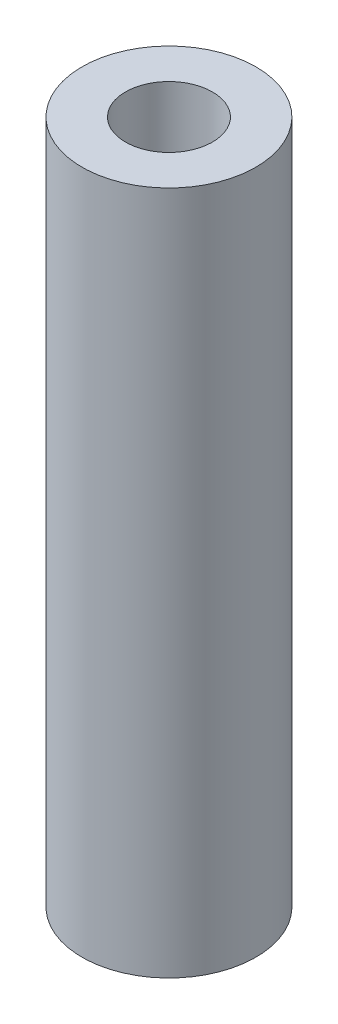
ISO-10303-21;
HEADER;
FILE_DESCRIPTION(('STEP AP214'),'2;1');
FILE_NAME('part.step','',(''),(''),'','','');
FILE_SCHEMA(('AUTOMOTIVE_DESIGN { 1 0 10303 214 1 1 1 1 }'));
ENDSEC;
DATA;
#1=APPLICATION_CONTEXT('core data for automotive mechanical design processes');
#2=APPLICATION_PROTOCOL_DEFINITION('international standard','automotive_design',2000,#1);
#3=PRODUCT_CONTEXT('',#1,'mechanical');
#4=PRODUCT('Part','Part','',(#3));
#5=PRODUCT_RELATED_PRODUCT_CATEGORY('part','',(#4));
#6=PRODUCT_DEFINITION_FORMATION('','',#4);
#7=PRODUCT_DEFINITION_CONTEXT('part definition',#1,'design');
#8=PRODUCT_DEFINITION('design','',#6,#7);
#9=PRODUCT_DEFINITION_SHAPE('','',#8);
#10=(LENGTH_UNIT() NAMED_UNIT(*) SI_UNIT(.MILLI.,.METRE.));
#11=(NAMED_UNIT(*) PLANE_ANGLE_UNIT() SI_UNIT($,.RADIAN.));
#12=(NAMED_UNIT(*) SI_UNIT($,.STERADIAN.) SOLID_ANGLE_UNIT());
#13=UNCERTAINTY_MEASURE_WITH_UNIT(LENGTH_MEASURE(1.E-05),#10,'distance_accuracy_value','');
#14=(GEOMETRIC_REPRESENTATION_CONTEXT(3) GLOBAL_UNCERTAINTY_ASSIGNED_CONTEXT((#13)) GLOBAL_UNIT_ASSIGNED_CONTEXT((#10,
#11,#12)) REPRESENTATION_CONTEXT('',''));
#15=CARTESIAN_POINT('',(0.,0.,0.));
#16=DIRECTION('',(0.,0.,1.));
#17=DIRECTION('',(1.,0.,0.));
#18=AXIS2_PLACEMENT_3D('',#15,#16,#17);
#19=CARTESIAN_POINT('',(-32.5248384950962,49.9618,-24.5388290431753));
#20=DIRECTION('',(0.,1.,0.));
#21=DIRECTION('',(0.,0.,1.));
#22=AXIS2_PLACEMENT_3D('',#19,#20,#21);
#23=PLANE('',#22);
#24=CARTESIAN_POINT('',(-32.5248384950962,49.9618,-24.5388290431753));
#25=DIRECTION('',(0.,1.,0.));
#26=DIRECTION('',(0.,0.,1.));
#27=AXIS2_PLACEMENT_3D('',#24,#25,#26);
#28=CIRCLE('',#27,6.35);
#29=CARTESIAN_POINT('',(-32.5248384950962,49.9618,-30.8888290431753));
#30=VERTEX_POINT('',#29);
#31=EDGE_CURVE('E10',#30,#30,#28,.T.);
#32=ORIENTED_EDGE('',*,*,#31,.T.);
#33=EDGE_LOOP('',(#32));
#34=FACE_BOUND('',#33,.T.);
#35=CARTESIAN_POINT('',(-32.5248384950962,49.9618,-24.5388290431753));
#36=DIRECTION('',(0.,1.,0.));
#37=DIRECTION('',(0.,0.,1.));
#38=AXIS2_PLACEMENT_3D('',#35,#36,#37);
#39=CIRCLE('',#38,3.175);
#40=CARTESIAN_POINT('',(-32.5248384950962,49.9618,-27.7138290431753));
#41=VERTEX_POINT('',#40);
#42=EDGE_CURVE('E41',#41,#41,#39,.T.);
#43=ORIENTED_EDGE('',*,*,#42,.F.);
#44=EDGE_LOOP('',(#43));
#45=FACE_BOUND('',#44,.T.);
#46=ADVANCED_FACE('F30',(#34,#45),#23,.T.);
#47=CARTESIAN_POINT('',(-32.5248384950962,0.,-24.5388290431753));
#48=DIRECTION('',(0.,1.,0.));
#49=DIRECTION('',(0.,0.,1.));
#50=AXIS2_PLACEMENT_3D('',#47,#48,#49);
#51=PLANE('',#50);
#52=CARTESIAN_POINT('',(-32.5248384950962,0.,-24.5388290431753));
#53=DIRECTION('',(0.,1.,0.));
#54=DIRECTION('',(0.,0.,1.));
#55=AXIS2_PLACEMENT_3D('',#52,#53,#54);
#56=CIRCLE('',#55,6.35);
#57=CARTESIAN_POINT('',(-32.5248384950962,0.,-30.8888290431753));
#58=VERTEX_POINT('',#57);
#59=EDGE_CURVE('E34',#58,#58,#56,.T.);
#60=ORIENTED_EDGE('',*,*,#59,.F.);
#61=EDGE_LOOP('',(#60));
#62=FACE_BOUND('',#61,.T.);
#63=CARTESIAN_POINT('',(-32.5248384950962,0.,-24.5388290431753));
#64=DIRECTION('',(0.,1.,0.));
#65=DIRECTION('',(0.,0.,1.));
#66=AXIS2_PLACEMENT_3D('',#63,#64,#65);
#67=CIRCLE('',#66,3.175);
#68=CARTESIAN_POINT('',(-32.5248384950962,0.,-27.7138290431753));
#69=VERTEX_POINT('',#68);
#70=EDGE_CURVE('E43',#69,#69,#67,.T.);
#71=ORIENTED_EDGE('',*,*,#70,.T.);
#72=EDGE_LOOP('',(#71));
#73=FACE_BOUND('',#72,.T.);
#74=ADVANCED_FACE('F53',(#62,#73),#51,.F.);
#75=CARTESIAN_POINT('',(-32.5248384950962,49.9618,-24.5388290431753));
#76=DIRECTION('',(0.,-1.,0.));
#77=DIRECTION('',(0.,0.,-1.));
#78=AXIS2_PLACEMENT_3D('',#75,#76,#77);
#79=CYLINDRICAL_SURFACE('',#78,6.35);
#80=CARTESIAN_POINT('',(-32.5248384950962,49.9618,-30.8888290431753));
#81=CARTESIAN_POINT('',(-32.5248384950962,49.4413645833333,-30.8888290431753));
#82=CARTESIAN_POINT('',(-32.5248384950962,48.9209291666667,-30.8888290431753));
#83=CARTESIAN_POINT('',(-32.5248384950962,47.8800583333333,-30.8888290431753));
#84=CARTESIAN_POINT('',(-32.5248384950962,47.3596229166667,-30.8888290431753));
#85=CARTESIAN_POINT('',(-32.5248384950962,46.3187520833333,-30.8888290431753));
#86=CARTESIAN_POINT('',(-32.5248384950962,45.7983166666667,-30.8888290431753));
#87=CARTESIAN_POINT('',(-32.5248384950962,44.7574458333333,-30.8888290431753));
#88=CARTESIAN_POINT('',(-32.5248384950962,44.2370104166667,-30.8888290431753));
#89=CARTESIAN_POINT('',(-32.5248384950962,43.1961395833333,-30.8888290431753));
#90=CARTESIAN_POINT('',(-32.5248384950962,42.6757041666667,-30.8888290431753));
#91=CARTESIAN_POINT('',(-32.5248384950962,41.6348333333333,-30.8888290431753));
#92=CARTESIAN_POINT('',(-32.5248384950962,41.1143979166667,-30.8888290431753));
#93=CARTESIAN_POINT('',(-32.5248384950962,40.0735270833333,-30.8888290431753));
#94=CARTESIAN_POINT('',(-32.5248384950962,39.5530916666667,-30.8888290431753));
#95=CARTESIAN_POINT('',(-32.5248384950962,38.5122208333333,-30.8888290431753));
#96=CARTESIAN_POINT('',(-32.5248384950962,37.9917854166667,-30.8888290431753));
#97=CARTESIAN_POINT('',(-32.5248384950962,36.9509145833333,-30.8888290431753));
#98=CARTESIAN_POINT('',(-32.5248384950962,36.4304791666667,-30.8888290431753));
#99=CARTESIAN_POINT('',(-32.5248384950962,35.3896083333333,-30.8888290431753));
#100=CARTESIAN_POINT('',(-32.5248384950962,34.8691729166667,-30.8888290431753));
#101=CARTESIAN_POINT('',(-32.5248384950962,33.8283020833333,-30.8888290431753));
#102=CARTESIAN_POINT('',(-32.5248384950962,33.3078666666667,-30.8888290431753));
#103=CARTESIAN_POINT('',(-32.5248384950962,32.2669958333333,-30.8888290431753));
#104=CARTESIAN_POINT('',(-32.5248384950962,31.7465604166667,-30.8888290431753));
#105=CARTESIAN_POINT('',(-32.5248384950962,30.7056895833333,-30.8888290431753));
#106=CARTESIAN_POINT('',(-32.5248384950962,30.1852541666667,-30.8888290431753));
#107=CARTESIAN_POINT('',(-32.5248384950962,29.1443833333333,-30.8888290431753));
#108=CARTESIAN_POINT('',(-32.5248384950962,28.6239479166667,-30.8888290431753));
#109=CARTESIAN_POINT('',(-32.5248384950962,27.5830770833333,-30.8888290431753));
#110=CARTESIAN_POINT('',(-32.5248384950962,27.0626416666667,-30.8888290431753));
#111=CARTESIAN_POINT('',(-32.5248384950962,26.0217708333333,-30.8888290431753));
#112=CARTESIAN_POINT('',(-32.5248384950962,25.5013354166667,-30.8888290431753));
#113=CARTESIAN_POINT('',(-32.5248384950962,24.4604645833333,-30.8888290431753));
#114=CARTESIAN_POINT('',(-32.5248384950962,23.9400291666667,-30.8888290431753));
#115=CARTESIAN_POINT('',(-32.5248384950962,22.8991583333333,-30.8888290431753));
#116=CARTESIAN_POINT('',(-32.5248384950962,22.3787229166667,-30.8888290431753));
#117=CARTESIAN_POINT('',(-32.5248384950962,21.3378520833333,-30.8888290431753));
#118=CARTESIAN_POINT('',(-32.5248384950962,20.8174166666667,-30.8888290431753));
#119=CARTESIAN_POINT('',(-32.5248384950962,19.7765458333333,-30.8888290431753));
#120=CARTESIAN_POINT('',(-32.5248384950962,19.2561104166667,-30.8888290431753));
#121=CARTESIAN_POINT('',(-32.5248384950962,18.2152395833333,-30.8888290431753));
#122=CARTESIAN_POINT('',(-32.5248384950962,17.6948041666667,-30.8888290431753));
#123=CARTESIAN_POINT('',(-32.5248384950962,16.6539333333333,-30.8888290431753));
#124=CARTESIAN_POINT('',(-32.5248384950962,16.1334979166667,-30.8888290431753));
#125=CARTESIAN_POINT('',(-32.5248384950962,15.0926270833333,-30.8888290431753));
#126=CARTESIAN_POINT('',(-32.5248384950962,14.5721916666667,-30.8888290431753));
#127=CARTESIAN_POINT('',(-32.5248384950962,13.5313208333333,-30.8888290431753));
#128=CARTESIAN_POINT('',(-32.5248384950962,13.0108854166667,-30.8888290431753));
#129=CARTESIAN_POINT('',(-32.5248384950962,11.9700145833333,-30.8888290431753));
#130=CARTESIAN_POINT('',(-32.5248384950962,11.4495791666667,-30.8888290431753));
#131=CARTESIAN_POINT('',(-32.5248384950962,10.4087083333333,-30.8888290431753));
#132=CARTESIAN_POINT('',(-32.5248384950962,9.88827291666666,-30.8888290431753));
#133=CARTESIAN_POINT('',(-32.5248384950962,8.84740208333333,-30.8888290431753));
#134=CARTESIAN_POINT('',(-32.5248384950962,8.32696666666666,-30.8888290431753));
#135=CARTESIAN_POINT('',(-32.5248384950962,7.28609583333333,-30.8888290431753));
#136=CARTESIAN_POINT('',(-32.5248384950962,6.76566041666666,-30.8888290431753));
#137=CARTESIAN_POINT('',(-32.5248384950962,5.72478958333333,-30.8888290431753));
#138=CARTESIAN_POINT('',(-32.5248384950962,5.20435416666666,-30.8888290431753));
#139=CARTESIAN_POINT('',(-32.5248384950962,4.16348333333333,-30.8888290431753));
#140=CARTESIAN_POINT('',(-32.5248384950962,3.64304791666666,-30.8888290431753));
#141=CARTESIAN_POINT('',(-32.5248384950962,2.60217708333333,-30.8888290431753));
#142=CARTESIAN_POINT('',(-32.5248384950962,2.08174166666666,-30.8888290431753));
#143=CARTESIAN_POINT('',(-32.5248384950962,1.04087083333333,-30.8888290431753));
#144=CARTESIAN_POINT('',(-32.5248384950962,0.520435416666659,-30.8888290431753));
#145=CARTESIAN_POINT('',(-32.5248384950962,0.,-30.8888290431753));
#146=B_SPLINE_CURVE_WITH_KNOTS('',3,(#80,#81,#82,#83,#84,#85,#86,#87,#88,#89,#90,#91,#92,#93,
#94,#95,#96,#97,#98,#99,#100,#101,#102,#103,#104,#105,#106,#107,#108,#109,#110,#111,#112,#113,
#114,#115,#116,#117,#118,#119,#120,#121,#122,#123,#124,#125,#126,#127,#128,#129,#130,#131,#132,
#133,#134,#135,#136,#137,#138,#139,#140,#141,#142,#143,#144,#145),.UNSPECIFIED.,.F.,.F.,(4,2,2,
2,2,2,2,2,2,2,2,2,2,2,2,2,2,2,2,2,2,2,2,2,2,2,2,2,2,2,2,2,4),(0.,1.56130625,3.1226125,
4.68391874999999,6.245225,7.80653125,9.3678375,10.92914375,12.49045,14.05175625,15.6130625,
17.17436875,18.735675,20.29698125,21.8582875,23.41959375,24.9809,26.54220625,28.1035125,
29.66481875,31.226125,32.78743125,34.3487375,35.91004375,37.47135,39.03265625,40.5939625,
42.15526875,43.716575,45.27788125,46.8391875,48.40049375,49.9618),.UNSPECIFIED.);
#147=EDGE_CURVE('BSEAM32',#30,#58,#146,.T.);
#148=ORIENTED_EDGE('',*,*,#31,.F.);
#149=ORIENTED_EDGE('',*,*,#59,.T.);
#150=ORIENTED_EDGE('',*,*,#147,.T.);
#151=ORIENTED_EDGE('',*,*,#147,.F.);
#152=EDGE_LOOP('',(#148,#150,#149,#151));
#153=FACE_BOUND('',#152,.T.);
#154=ADVANCED_FACE('F32',(#153),#79,.T.);
#155=CARTESIAN_POINT('',(-32.5248384950962,49.9618,-24.5388290431753));
#156=DIRECTION('',(0.,-1.,0.));
#157=DIRECTION('',(0.,0.,-1.));
#158=AXIS2_PLACEMENT_3D('',#155,#156,#157);
#159=CYLINDRICAL_SURFACE('',#158,3.175);
#160=CARTESIAN_POINT('',(-32.5248384950962,49.9618,-27.7138290431753));
#161=CARTESIAN_POINT('',(-32.5248384950962,49.4413645833333,-27.7138290431753));
#162=CARTESIAN_POINT('',(-32.5248384950962,48.9209291666667,-27.7138290431753));
#163=CARTESIAN_POINT('',(-32.5248384950962,47.8800583333333,-27.7138290431753));
#164=CARTESIAN_POINT('',(-32.5248384950962,47.3596229166667,-27.7138290431753));
#165=CARTESIAN_POINT('',(-32.5248384950962,46.3187520833333,-27.7138290431753));
#166=CARTESIAN_POINT('',(-32.5248384950962,45.7983166666667,-27.7138290431753));
#167=CARTESIAN_POINT('',(-32.5248384950962,44.7574458333333,-27.7138290431753));
#168=CARTESIAN_POINT('',(-32.5248384950962,44.2370104166667,-27.7138290431753));
#169=CARTESIAN_POINT('',(-32.5248384950962,43.1961395833333,-27.7138290431753));
#170=CARTESIAN_POINT('',(-32.5248384950962,42.6757041666667,-27.7138290431753));
#171=CARTESIAN_POINT('',(-32.5248384950962,41.6348333333333,-27.7138290431753));
#172=CARTESIAN_POINT('',(-32.5248384950962,41.1143979166667,-27.7138290431753));
#173=CARTESIAN_POINT('',(-32.5248384950962,40.0735270833333,-27.7138290431753));
#174=CARTESIAN_POINT('',(-32.5248384950962,39.5530916666667,-27.7138290431753));
#175=CARTESIAN_POINT('',(-32.5248384950962,38.5122208333333,-27.7138290431753));
#176=CARTESIAN_POINT('',(-32.5248384950962,37.9917854166667,-27.7138290431753));
#177=CARTESIAN_POINT('',(-32.5248384950962,36.9509145833333,-27.7138290431753));
#178=CARTESIAN_POINT('',(-32.5248384950962,36.4304791666667,-27.7138290431753));
#179=CARTESIAN_POINT('',(-32.5248384950962,35.3896083333333,-27.7138290431753));
#180=CARTESIAN_POINT('',(-32.5248384950962,34.8691729166667,-27.7138290431753));
#181=CARTESIAN_POINT('',(-32.5248384950962,33.8283020833333,-27.7138290431753));
#182=CARTESIAN_POINT('',(-32.5248384950962,33.3078666666667,-27.7138290431753));
#183=CARTESIAN_POINT('',(-32.5248384950962,32.2669958333333,-27.7138290431753));
#184=CARTESIAN_POINT('',(-32.5248384950962,31.7465604166667,-27.7138290431753));
#185=CARTESIAN_POINT('',(-32.5248384950962,30.7056895833333,-27.7138290431753));
#186=CARTESIAN_POINT('',(-32.5248384950962,30.1852541666667,-27.7138290431753));
#187=CARTESIAN_POINT('',(-32.5248384950962,29.1443833333333,-27.7138290431753));
#188=CARTESIAN_POINT('',(-32.5248384950962,28.6239479166667,-27.7138290431753));
#189=CARTESIAN_POINT('',(-32.5248384950962,27.5830770833333,-27.7138290431753));
#190=CARTESIAN_POINT('',(-32.5248384950962,27.0626416666667,-27.7138290431753));
#191=CARTESIAN_POINT('',(-32.5248384950962,26.0217708333333,-27.7138290431753));
#192=CARTESIAN_POINT('',(-32.5248384950962,25.5013354166667,-27.7138290431753));
#193=CARTESIAN_POINT('',(-32.5248384950962,24.4604645833333,-27.7138290431753));
#194=CARTESIAN_POINT('',(-32.5248384950962,23.9400291666667,-27.7138290431753));
#195=CARTESIAN_POINT('',(-32.5248384950962,22.8991583333333,-27.7138290431753));
#196=CARTESIAN_POINT('',(-32.5248384950962,22.3787229166667,-27.7138290431753));
#197=CARTESIAN_POINT('',(-32.5248384950962,21.3378520833333,-27.7138290431753));
#198=CARTESIAN_POINT('',(-32.5248384950962,20.8174166666667,-27.7138290431753));
#199=CARTESIAN_POINT('',(-32.5248384950962,19.7765458333333,-27.7138290431753));
#200=CARTESIAN_POINT('',(-32.5248384950962,19.2561104166667,-27.7138290431753));
#201=CARTESIAN_POINT('',(-32.5248384950962,18.2152395833333,-27.7138290431753));
#202=CARTESIAN_POINT('',(-32.5248384950962,17.6948041666667,-27.7138290431753));
#203=CARTESIAN_POINT('',(-32.5248384950962,16.6539333333333,-27.7138290431753));
#204=CARTESIAN_POINT('',(-32.5248384950962,16.1334979166667,-27.7138290431753));
#205=CARTESIAN_POINT('',(-32.5248384950962,15.0926270833333,-27.7138290431753));
#206=CARTESIAN_POINT('',(-32.5248384950962,14.5721916666667,-27.7138290431753));
#207=CARTESIAN_POINT('',(-32.5248384950962,13.5313208333333,-27.7138290431753));
#208=CARTESIAN_POINT('',(-32.5248384950962,13.0108854166667,-27.7138290431753));
#209=CARTESIAN_POINT('',(-32.5248384950962,11.9700145833333,-27.7138290431753));
#210=CARTESIAN_POINT('',(-32.5248384950962,11.4495791666667,-27.7138290431753));
#211=CARTESIAN_POINT('',(-32.5248384950962,10.4087083333333,-27.7138290431753));
#212=CARTESIAN_POINT('',(-32.5248384950962,9.88827291666666,-27.7138290431753));
#213=CARTESIAN_POINT('',(-32.5248384950962,8.84740208333333,-27.7138290431753));
#214=CARTESIAN_POINT('',(-32.5248384950962,8.32696666666666,-27.7138290431753));
#215=CARTESIAN_POINT('',(-32.5248384950962,7.28609583333333,-27.7138290431753));
#216=CARTESIAN_POINT('',(-32.5248384950962,6.76566041666666,-27.7138290431753));
#217=CARTESIAN_POINT('',(-32.5248384950962,5.72478958333333,-27.7138290431753));
#218=CARTESIAN_POINT('',(-32.5248384950962,5.20435416666666,-27.7138290431753));
#219=CARTESIAN_POINT('',(-32.5248384950962,4.16348333333333,-27.7138290431753));
#220=CARTESIAN_POINT('',(-32.5248384950962,3.64304791666666,-27.7138290431753));
#221=CARTESIAN_POINT('',(-32.5248384950962,2.60217708333333,-27.7138290431753));
#222=CARTESIAN_POINT('',(-32.5248384950962,2.08174166666666,-27.7138290431753));
#223=CARTESIAN_POINT('',(-32.5248384950962,1.04087083333333,-27.7138290431753));
#224=CARTESIAN_POINT('',(-32.5248384950962,0.520435416666659,-27.7138290431753));
#225=CARTESIAN_POINT('',(-32.5248384950962,0.,-27.7138290431753));
#226=B_SPLINE_CURVE_WITH_KNOTS('',3,(#160,#161,#162,#163,#164,#165,#166,#167,#168,#169,#170,
#171,#172,#173,#174,#175,#176,#177,#178,#179,#180,#181,#182,#183,#184,#185,#186,#187,#188,#189,
#190,#191,#192,#193,#194,#195,#196,#197,#198,#199,#200,#201,#202,#203,#204,#205,#206,#207,#208,
#209,#210,#211,#212,#213,#214,#215,#216,#217,#218,#219,#220,#221,#222,#223,#224,#225),
.UNSPECIFIED.,.F.,.F.,(4,2,2,2,2,2,2,2,2,2,2,2,2,2,2,2,2,2,2,2,2,2,2,2,2,2,2,2,2,2,2,2,4),(0.,
1.56130625,3.1226125,4.68391874999999,6.245225,7.80653125,9.3678375,10.92914375,12.49045,
14.05175625,15.6130625,17.17436875,18.735675,20.29698125,21.8582875,23.41959375,24.9809,
26.54220625,28.1035125,29.66481875,31.226125,32.78743125,34.3487375,35.91004375,37.47135,
39.03265625,40.5939625,42.15526875,43.716575,45.27788125,46.8391875,48.40049375,49.9618),.UNSPECIFIED.);
#227=EDGE_CURVE('BSEAM49',#41,#69,#226,.T.);
#228=ORIENTED_EDGE('',*,*,#42,.T.);
#229=ORIENTED_EDGE('',*,*,#70,.F.);
#230=ORIENTED_EDGE('',*,*,#227,.T.);
#231=ORIENTED_EDGE('',*,*,#227,.F.);
#232=EDGE_LOOP('',(#228,#230,#229,#231));
#233=FACE_BOUND('',#232,.T.);
#234=ADVANCED_FACE('F49',(#233),#159,.F.);
#235=CLOSED_SHELL('',(#46,#74,#154,#234));
#236=MANIFOLD_SOLID_BREP('B2',#235);
#237=ADVANCED_BREP_SHAPE_REPRESENTATION('',(#18,#236),#14);
#238=SHAPE_DEFINITION_REPRESENTATION(#9,#237);
ENDSEC;
END-ISO-10303-21;
